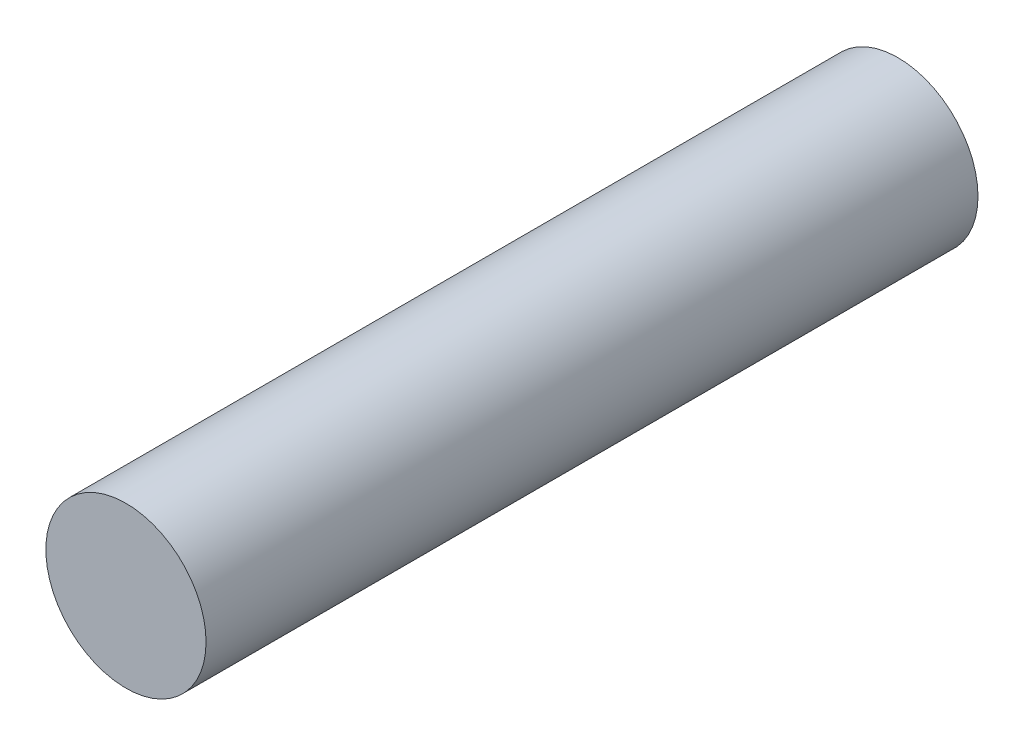
ISO-10303-21;
HEADER;
FILE_DESCRIPTION(('STEP AP214'),'2;1');
FILE_NAME('part.step','',(''),(''),'','','');
FILE_SCHEMA(('AUTOMOTIVE_DESIGN { 1 0 10303 214 1 1 1 1 }'));
ENDSEC;
DATA;
#1=APPLICATION_CONTEXT('core data for automotive mechanical design processes');
#2=APPLICATION_PROTOCOL_DEFINITION('international standard','automotive_design',2000,#1);
#3=PRODUCT_CONTEXT('',#1,'mechanical');
#4=PRODUCT('Part','Part','',(#3));
#5=PRODUCT_RELATED_PRODUCT_CATEGORY('part','',(#4));
#6=PRODUCT_DEFINITION_FORMATION('','',#4);
#7=PRODUCT_DEFINITION_CONTEXT('part definition',#1,'design');
#8=PRODUCT_DEFINITION('design','',#6,#7);
#9=PRODUCT_DEFINITION_SHAPE('','',#8);
#10=(LENGTH_UNIT() NAMED_UNIT(*) SI_UNIT(.MILLI.,.METRE.));
#11=(NAMED_UNIT(*) PLANE_ANGLE_UNIT() SI_UNIT($,.RADIAN.));
#12=(NAMED_UNIT(*) SI_UNIT($,.STERADIAN.) SOLID_ANGLE_UNIT());
#13=UNCERTAINTY_MEASURE_WITH_UNIT(LENGTH_MEASURE(1.E-05),#10,'distance_accuracy_value','');
#14=(GEOMETRIC_REPRESENTATION_CONTEXT(3) GLOBAL_UNCERTAINTY_ASSIGNED_CONTEXT((#13)) GLOBAL_UNIT_ASSIGNED_CONTEXT((#10,
#11,#12)) REPRESENTATION_CONTEXT('',''));
#15=CARTESIAN_POINT('',(0.,0.,0.));
#16=DIRECTION('',(0.,0.,1.));
#17=DIRECTION('',(1.,0.,0.));
#18=AXIS2_PLACEMENT_3D('',#15,#16,#17);
#19=CARTESIAN_POINT('',(0.,0.,53.));
#20=DIRECTION('',(0.,0.,-1.));
#21=DIRECTION('',(-1.,0.,0.));
#22=AXIS2_PLACEMENT_3D('',#19,#20,#21);
#23=CYLINDRICAL_SURFACE('',#22,5.5);
#24=CARTESIAN_POINT('',(0.,0.,53.));
#25=DIRECTION('',(0.,0.,1.));
#26=DIRECTION('',(1.,0.,0.));
#27=AXIS2_PLACEMENT_3D('',#24,#25,#26);
#28=CIRCLE('',#27,5.5);
#29=CARTESIAN_POINT('',(5.5,0.,53.));
#30=VERTEX_POINT('',#29);
#31=EDGE_CURVE('E10',#30,#30,#28,.T.);
#32=ORIENTED_EDGE('',*,*,#31,.F.);
#33=EDGE_LOOP('',(#32));
#34=FACE_BOUND('',#33,.T.);
#35=CARTESIAN_POINT('',(0.,0.,0.));
#36=DIRECTION('',(0.,0.,1.));
#37=DIRECTION('',(1.,0.,0.));
#38=AXIS2_PLACEMENT_3D('',#35,#36,#37);
#39=CIRCLE('',#38,5.5);
#40=CARTESIAN_POINT('',(5.5,0.,0.));
#41=VERTEX_POINT('',#40);
#42=EDGE_CURVE('E40',#41,#41,#39,.T.);
#43=ORIENTED_EDGE('',*,*,#42,.T.);
#44=EDGE_LOOP('',(#43));
#45=FACE_BOUND('',#44,.T.);
#46=ADVANCED_FACE('F37',(#34,#45),#23,.T.);
#47=CARTESIAN_POINT('',(0.,0.,53.));
#48=DIRECTION('',(0.,0.,1.));
#49=DIRECTION('',(1.,0.,0.));
#50=AXIS2_PLACEMENT_3D('',#47,#48,#49);
#51=PLANE('',#50);
#52=ORIENTED_EDGE('',*,*,#31,.T.);
#53=EDGE_LOOP('',(#52));
#54=FACE_BOUND('',#53,.T.);
#55=ADVANCED_FACE('F52',(#54),#51,.T.);
#56=CARTESIAN_POINT('',(0.,0.,0.));
#57=DIRECTION('',(0.,0.,1.));
#58=DIRECTION('',(1.,0.,0.));
#59=AXIS2_PLACEMENT_3D('',#56,#57,#58);
#60=PLANE('',#59);
#61=ORIENTED_EDGE('',*,*,#42,.F.);
#62=EDGE_LOOP('',(#61));
#63=FACE_BOUND('',#62,.T.);
#64=ADVANCED_FACE('F50',(#63),#60,.F.);
#65=CLOSED_SHELL('',(#46,#55,#64));
#66=MANIFOLD_SOLID_BREP('B2',#65);
#67=ADVANCED_BREP_SHAPE_REPRESENTATION('',(#18,#66),#14);
#68=SHAPE_DEFINITION_REPRESENTATION(#9,#67);
ENDSEC;
END-ISO-10303-21;
